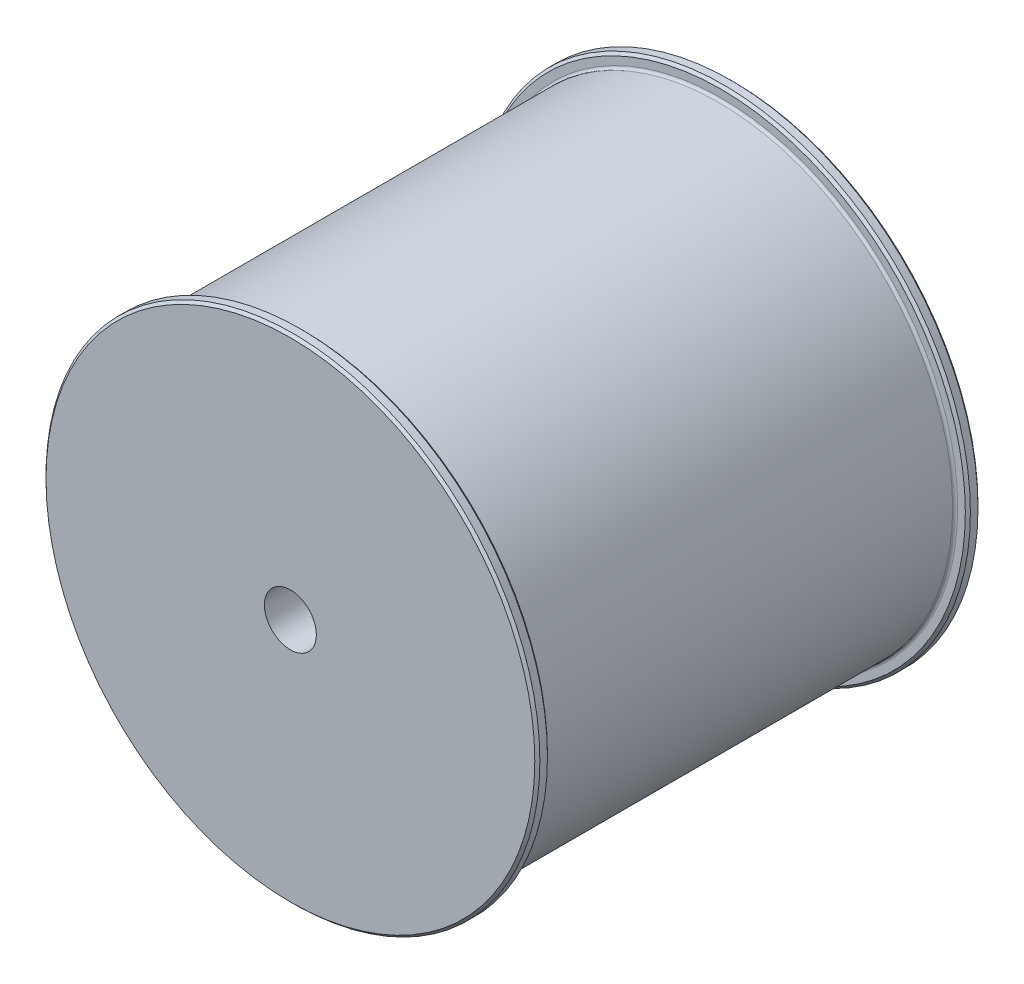
ISO-10303-21;
HEADER;
FILE_DESCRIPTION(('STEP AP214'),'2;1');
FILE_NAME('part.step','',(''),(''),'','','');
FILE_SCHEMA(('AUTOMOTIVE_DESIGN { 1 0 10303 214 1 1 1 1 }'));
ENDSEC;
DATA;
#1=APPLICATION_CONTEXT('core data for automotive mechanical design processes');
#2=APPLICATION_PROTOCOL_DEFINITION('international standard','automotive_design',2000,#1);
#3=PRODUCT_CONTEXT('',#1,'mechanical');
#4=PRODUCT('Part','Part','',(#3));
#5=PRODUCT_RELATED_PRODUCT_CATEGORY('part','',(#4));
#6=PRODUCT_DEFINITION_FORMATION('','',#4);
#7=PRODUCT_DEFINITION_CONTEXT('part definition',#1,'design');
#8=PRODUCT_DEFINITION('design','',#6,#7);
#9=PRODUCT_DEFINITION_SHAPE('','',#8);
#10=(LENGTH_UNIT() NAMED_UNIT(*) SI_UNIT(.MILLI.,.METRE.));
#11=(NAMED_UNIT(*) PLANE_ANGLE_UNIT() SI_UNIT($,.RADIAN.));
#12=(NAMED_UNIT(*) SI_UNIT($,.STERADIAN.) SOLID_ANGLE_UNIT());
#13=UNCERTAINTY_MEASURE_WITH_UNIT(LENGTH_MEASURE(1.E-05),#10,'distance_accuracy_value','');
#14=(GEOMETRIC_REPRESENTATION_CONTEXT(3) GLOBAL_UNCERTAINTY_ASSIGNED_CONTEXT((#13)) GLOBAL_UNIT_ASSIGNED_CONTEXT((#10,
#11,#12)) REPRESENTATION_CONTEXT('',''));
#15=CARTESIAN_POINT('',(0.,0.,0.));
#16=DIRECTION('',(0.,0.,1.));
#17=DIRECTION('',(1.,0.,0.));
#18=AXIS2_PLACEMENT_3D('',#15,#16,#17);
#19=CARTESIAN_POINT('',(0.,0.,1.));
#20=DIRECTION('',(0.,0.,-1.));
#21=DIRECTION('',(-1.,0.,0.));
#22=AXIS2_PLACEMENT_3D('',#19,#20,#21);
#23=CYLINDRICAL_SURFACE('',#22,19.5);
#24=CARTESIAN_POINT('',(0.,0.,0.199999999999999));
#25=DIRECTION('',(0.,0.,1.));
#26=DIRECTION('',(1.,0.,0.));
#27=AXIS2_PLACEMENT_3D('',#24,#25,#26);
#28=CIRCLE('',#27,19.5);
#29=CARTESIAN_POINT('',(19.5,0.,0.199999999999999));
#30=VERTEX_POINT('',#29);
#31=EDGE_CURVE('E53',#30,#30,#28,.T.);
#32=ORIENTED_EDGE('',*,*,#31,.T.);
#33=EDGE_LOOP('',(#32));
#34=FACE_BOUND('',#33,.T.);
#35=CARTESIAN_POINT('',(0.,0.,0.800000000000001));
#36=DIRECTION('',(0.,0.,1.));
#37=DIRECTION('',(1.,0.,0.));
#38=AXIS2_PLACEMENT_3D('',#35,#36,#37);
#39=CIRCLE('',#38,19.5);
#40=CARTESIAN_POINT('',(19.5,0.,0.800000000000001));
#41=VERTEX_POINT('',#40);
#42=EDGE_CURVE('E58',#41,#41,#39,.F.);
#43=ORIENTED_EDGE('',*,*,#42,.T.);
#44=EDGE_LOOP('',(#43));
#45=FACE_BOUND('',#44,.T.);
#46=ADVANCED_FACE('F39',(#34,#45),#23,.T.);
#47=CARTESIAN_POINT('',(0.,0.,1.));
#48=DIRECTION('',(0.,0.,1.));
#49=DIRECTION('',(1.,0.,0.));
#50=AXIS2_PLACEMENT_3D('',#47,#48,#49);
#51=PLANE('',#50);
#52=CARTESIAN_POINT('',(0.,0.,1.));
#53=DIRECTION('',(0.,0.,1.));
#54=DIRECTION('',(1.,0.,0.));
#55=AXIS2_PLACEMENT_3D('',#52,#53,#54);
#56=CIRCLE('',#55,19.3);
#57=CARTESIAN_POINT('',(19.3,0.,1.));
#58=VERTEX_POINT('',#57);
#59=EDGE_CURVE('E10',#58,#58,#56,.T.);
#60=ORIENTED_EDGE('',*,*,#59,.T.);
#61=EDGE_LOOP('',(#60));
#62=FACE_BOUND('',#61,.T.);
#63=CARTESIAN_POINT('',(0.,0.,1.));
#64=DIRECTION('',(0.,0.,1.));
#65=DIRECTION('',(1.,0.,0.));
#66=AXIS2_PLACEMENT_3D('',#63,#64,#65);
#67=CIRCLE('',#66,18.7);
#68=CARTESIAN_POINT('',(18.7,0.,1.));
#69=VERTEX_POINT('',#68);
#70=EDGE_CURVE('E84',#69,#69,#67,.F.);
#71=ORIENTED_EDGE('',*,*,#70,.T.);
#72=EDGE_LOOP('',(#71));
#73=FACE_BOUND('',#72,.T.);
#74=ADVANCED_FACE('F138',(#62,#73),#51,.T.);
#75=CARTESIAN_POINT('',(0.,0.,0.));
#76=DIRECTION('',(0.,0.,1.));
#77=DIRECTION('',(1.,0.,0.));
#78=AXIS2_PLACEMENT_3D('',#75,#76,#77);
#79=PLANE('',#78);
#80=CARTESIAN_POINT('',(0.,0.,0.));
#81=DIRECTION('',(0.,0.,1.));
#82=DIRECTION('',(1.,0.,0.));
#83=AXIS2_PLACEMENT_3D('',#80,#81,#82);
#84=CIRCLE('',#83,2.05);
#85=CARTESIAN_POINT('',(2.05,0.,0.));
#86=VERTEX_POINT('',#85);
#87=EDGE_CURVE('E96',#86,#86,#84,.T.);
#88=ORIENTED_EDGE('',*,*,#87,.T.);
#89=EDGE_LOOP('',(#88));
#90=FACE_BOUND('',#89,.T.);
#91=CARTESIAN_POINT('',(0.,0.,0.));
#92=DIRECTION('',(0.,0.,1.));
#93=DIRECTION('',(1.,0.,0.));
#94=AXIS2_PLACEMENT_3D('',#91,#92,#93);
#95=CIRCLE('',#94,19.3);
#96=CARTESIAN_POINT('',(19.3,0.,0.));
#97=VERTEX_POINT('',#96);
#98=EDGE_CURVE('E48',#97,#97,#95,.F.);
#99=ORIENTED_EDGE('',*,*,#98,.T.);
#100=EDGE_LOOP('',(#99));
#101=FACE_BOUND('',#100,.T.);
#102=ADVANCED_FACE('F105',(#90,#101),#79,.F.);
#103=CARTESIAN_POINT('',(0.,0.,34.));
#104=DIRECTION('',(0.,0.,-1.));
#105=DIRECTION('',(-1.,0.,0.));
#106=AXIS2_PLACEMENT_3D('',#103,#104,#105);
#107=CYLINDRICAL_SURFACE('',#106,18.5);
#108=CARTESIAN_POINT('',(0.,0.,1.2));
#109=DIRECTION('',(0.,0.,1.));
#110=DIRECTION('',(1.,0.,0.));
#111=AXIS2_PLACEMENT_3D('',#108,#109,#110);
#112=CIRCLE('',#111,18.5);
#113=CARTESIAN_POINT('',(18.5,0.,1.2));
#114=VERTEX_POINT('',#113);
#115=EDGE_CURVE('E88',#114,#114,#112,.T.);
#116=ORIENTED_EDGE('',*,*,#115,.T.);
#117=EDGE_LOOP('',(#116));
#118=FACE_BOUND('',#117,.T.);
#119=CARTESIAN_POINT('',(0.,0.,33.8));
#120=DIRECTION('',(0.,0.,1.));
#121=DIRECTION('',(1.,0.,0.));
#122=AXIS2_PLACEMENT_3D('',#119,#120,#121);
#123=CIRCLE('',#122,18.5);
#124=CARTESIAN_POINT('',(18.5,0.,33.8));
#125=VERTEX_POINT('',#124);
#126=EDGE_CURVE('E92',#125,#125,#123,.F.);
#127=ORIENTED_EDGE('',*,*,#126,.T.);
#128=EDGE_LOOP('',(#127));
#129=FACE_BOUND('',#128,.T.);
#130=ADVANCED_FACE('F178',(#118,#129),#107,.T.);
#131=CARTESIAN_POINT('',(0.,0.,35.));
#132=DIRECTION('',(0.,0.,-1.));
#133=DIRECTION('',(-1.,0.,0.));
#134=AXIS2_PLACEMENT_3D('',#131,#132,#133);
#135=CYLINDRICAL_SURFACE('',#134,19.5);
#136=CARTESIAN_POINT('',(0.,0.,34.2));
#137=DIRECTION('',(0.,0.,1.));
#138=DIRECTION('',(1.,0.,0.));
#139=AXIS2_PLACEMENT_3D('',#136,#137,#138);
#140=CIRCLE('',#139,19.5);
#141=CARTESIAN_POINT('',(19.5,0.,34.2));
#142=VERTEX_POINT('',#141);
#143=EDGE_CURVE('E72',#142,#142,#140,.T.);
#144=ORIENTED_EDGE('',*,*,#143,.T.);
#145=EDGE_LOOP('',(#144));
#146=FACE_BOUND('',#145,.T.);
#147=CARTESIAN_POINT('',(0.,0.,34.8));
#148=DIRECTION('',(0.,0.,1.));
#149=DIRECTION('',(1.,0.,0.));
#150=AXIS2_PLACEMENT_3D('',#147,#148,#149);
#151=CIRCLE('',#150,19.5);
#152=CARTESIAN_POINT('',(19.5,0.,34.8));
#153=VERTEX_POINT('',#152);
#154=EDGE_CURVE('E76',#153,#153,#151,.F.);
#155=ORIENTED_EDGE('',*,*,#154,.T.);
#156=EDGE_LOOP('',(#155));
#157=FACE_BOUND('',#156,.T.);
#158=ADVANCED_FACE('F117',(#146,#157),#135,.T.);
#159=CARTESIAN_POINT('',(0.,0.,35.));
#160=DIRECTION('',(0.,0.,1.));
#161=DIRECTION('',(1.,0.,0.));
#162=AXIS2_PLACEMENT_3D('',#159,#160,#161);
#163=PLANE('',#162);
#164=CARTESIAN_POINT('',(0.,0.,35.));
#165=DIRECTION('',(0.,0.,1.));
#166=DIRECTION('',(1.,0.,0.));
#167=AXIS2_PLACEMENT_3D('',#164,#165,#166);
#168=CIRCLE('',#167,2.05);
#169=CARTESIAN_POINT('',(2.05,0.,35.));
#170=VERTEX_POINT('',#169);
#171=EDGE_CURVE('E97',#170,#170,#168,.T.);
#172=ORIENTED_EDGE('',*,*,#171,.F.);
#173=EDGE_LOOP('',(#172));
#174=FACE_BOUND('',#173,.T.);
#175=CARTESIAN_POINT('',(0.,0.,35.));
#176=DIRECTION('',(0.,0.,1.));
#177=DIRECTION('',(1.,0.,0.));
#178=AXIS2_PLACEMENT_3D('',#175,#176,#177);
#179=CIRCLE('',#178,19.3);
#180=CARTESIAN_POINT('',(19.3,0.,35.));
#181=VERTEX_POINT('',#180);
#182=EDGE_CURVE('E64',#181,#181,#179,.T.);
#183=ORIENTED_EDGE('',*,*,#182,.T.);
#184=EDGE_LOOP('',(#183));
#185=FACE_BOUND('',#184,.T.);
#186=ADVANCED_FACE('F113',(#174,#185),#163,.T.);
#187=CARTESIAN_POINT('',(0.,0.,34.));
#188=DIRECTION('',(0.,0.,1.));
#189=DIRECTION('',(1.,0.,0.));
#190=AXIS2_PLACEMENT_3D('',#187,#188,#189);
#191=PLANE('',#190);
#192=CARTESIAN_POINT('',(0.,0.,34.));
#193=DIRECTION('',(0.,0.,1.));
#194=DIRECTION('',(1.,0.,0.));
#195=AXIS2_PLACEMENT_3D('',#192,#193,#194);
#196=CIRCLE('',#195,19.3);
#197=CARTESIAN_POINT('',(19.3,0.,34.));
#198=VERTEX_POINT('',#197);
#199=EDGE_CURVE('E68',#198,#198,#196,.F.);
#200=ORIENTED_EDGE('',*,*,#199,.T.);
#201=EDGE_LOOP('',(#200));
#202=FACE_BOUND('',#201,.T.);
#203=CARTESIAN_POINT('',(0.,0.,34.));
#204=DIRECTION('',(0.,0.,1.));
#205=DIRECTION('',(1.,0.,0.));
#206=AXIS2_PLACEMENT_3D('',#203,#204,#205);
#207=CIRCLE('',#206,18.7);
#208=CARTESIAN_POINT('',(18.7,0.,34.));
#209=VERTEX_POINT('',#208);
#210=EDGE_CURVE('E80',#209,#209,#207,.T.);
#211=ORIENTED_EDGE('',*,*,#210,.T.);
#212=EDGE_LOOP('',(#211));
#213=FACE_BOUND('',#212,.T.);
#214=ADVANCED_FACE('F116',(#202,#213),#191,.F.);
#215=CARTESIAN_POINT('',(0.,0.,1.2));
#216=DIRECTION('',(0.,0.,1.));
#217=DIRECTION('',(1.,0.,0.));
#218=AXIS2_PLACEMENT_3D('',#215,#216,#217);
#219=TOROIDAL_SURFACE('',#218,18.7,0.2);
#220=ORIENTED_EDGE('',*,*,#70,.F.);
#221=EDGE_LOOP('',(#220));
#222=FACE_BOUND('',#221,.T.);
#223=ORIENTED_EDGE('',*,*,#115,.F.);
#224=EDGE_LOOP('',(#223));
#225=FACE_BOUND('',#224,.T.);
#226=ADVANCED_FACE('F148',(#222,#225),#219,.F.);
#227=CARTESIAN_POINT('',(0.,0.,33.8));
#228=DIRECTION('',(0.,0.,1.));
#229=DIRECTION('',(1.,0.,0.));
#230=AXIS2_PLACEMENT_3D('',#227,#228,#229);
#231=TOROIDAL_SURFACE('',#230,18.7,0.2);
#232=ORIENTED_EDGE('',*,*,#126,.F.);
#233=EDGE_LOOP('',(#232));
#234=FACE_BOUND('',#233,.T.);
#235=ORIENTED_EDGE('',*,*,#210,.F.);
#236=EDGE_LOOP('',(#235));
#237=FACE_BOUND('',#236,.T.);
#238=ADVANCED_FACE('F132',(#234,#237),#231,.F.);
#239=CARTESIAN_POINT('',(0.,0.,34.2));
#240=DIRECTION('',(0.,0.,1.));
#241=DIRECTION('',(1.,0.,0.));
#242=AXIS2_PLACEMENT_3D('',#239,#240,#241);
#243=CONICAL_SURFACE('',#242,19.5,0.785398163397457);
#244=ORIENTED_EDGE('',*,*,#199,.F.);
#245=EDGE_LOOP('',(#244));
#246=FACE_BOUND('',#245,.T.);
#247=ORIENTED_EDGE('',*,*,#143,.F.);
#248=EDGE_LOOP('',(#247));
#249=FACE_BOUND('',#248,.T.);
#250=ADVANCED_FACE('F124',(#246,#249),#243,.T.);
#251=CARTESIAN_POINT('',(0.,0.,35.));
#252=DIRECTION('',(0.,0.,-1.));
#253=DIRECTION('',(-1.,0.,0.));
#254=AXIS2_PLACEMENT_3D('',#251,#252,#253);
#255=CONICAL_SURFACE('',#254,19.3,0.785398163397422);
#256=ORIENTED_EDGE('',*,*,#154,.F.);
#257=EDGE_LOOP('',(#256));
#258=FACE_BOUND('',#257,.T.);
#259=ORIENTED_EDGE('',*,*,#182,.F.);
#260=EDGE_LOOP('',(#259));
#261=FACE_BOUND('',#260,.T.);
#262=ADVANCED_FACE('F121',(#258,#261),#255,.T.);
#263=CARTESIAN_POINT('',(0.,0.,0.199999999999999));
#264=DIRECTION('',(0.,0.,1.));
#265=DIRECTION('',(1.,0.,0.));
#266=AXIS2_PLACEMENT_3D('',#263,#264,#265);
#267=CONICAL_SURFACE('',#266,19.5,0.785398163397448);
#268=ORIENTED_EDGE('',*,*,#98,.F.);
#269=EDGE_LOOP('',(#268));
#270=FACE_BOUND('',#269,.T.);
#271=ORIENTED_EDGE('',*,*,#31,.F.);
#272=EDGE_LOOP('',(#271));
#273=FACE_BOUND('',#272,.T.);
#274=ADVANCED_FACE('F123',(#270,#273),#267,.T.);
#275=CARTESIAN_POINT('',(0.,0.,1.));
#276=DIRECTION('',(0.,0.,-1.));
#277=DIRECTION('',(-1.,0.,0.));
#278=AXIS2_PLACEMENT_3D('',#275,#276,#277);
#279=CONICAL_SURFACE('',#278,19.3,0.785398163397422);
#280=ORIENTED_EDGE('',*,*,#42,.F.);
#281=EDGE_LOOP('',(#280));
#282=FACE_BOUND('',#281,.T.);
#283=ORIENTED_EDGE('',*,*,#59,.F.);
#284=EDGE_LOOP('',(#283));
#285=FACE_BOUND('',#284,.T.);
#286=ADVANCED_FACE('F42',(#282,#285),#279,.T.);
#287=CARTESIAN_POINT('',(0.,0.,0.));
#288=DIRECTION('',(0.,0.,1.));
#289=DIRECTION('',(1.,0.,0.));
#290=AXIS2_PLACEMENT_3D('',#287,#288,#289);
#291=CYLINDRICAL_SURFACE('',#290,2.05);
#292=ORIENTED_EDGE('',*,*,#87,.F.);
#293=EDGE_LOOP('',(#292));
#294=FACE_BOUND('',#293,.T.);
#295=ORIENTED_EDGE('',*,*,#171,.T.);
#296=EDGE_LOOP('',(#295));
#297=FACE_BOUND('',#296,.T.);
#298=ADVANCED_FACE('F107',(#294,#297),#291,.F.);
#299=CLOSED_SHELL('',(#46,#74,#102,#130,#158,#186,#214,#226,#238,#250,#262,#274,#286,#298));
#300=MANIFOLD_SOLID_BREP('B2',#299);
#301=ADVANCED_BREP_SHAPE_REPRESENTATION('',(#18,#300),#14);
#302=SHAPE_DEFINITION_REPRESENTATION(#9,#301);
ENDSEC;
END-ISO-10303-21;
